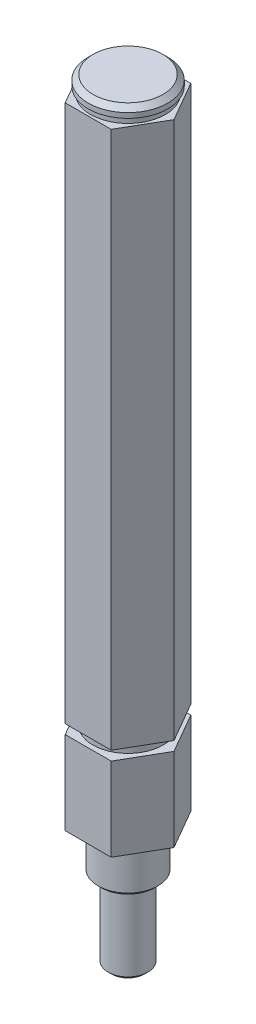
ISO-10303-21;
HEADER;
FILE_DESCRIPTION(('STEP AP214'),'2;1');
FILE_NAME('part.step','',(''),(''),'','','');
FILE_SCHEMA(('AUTOMOTIVE_DESIGN { 1 0 10303 214 1 1 1 1 }'));
ENDSEC;
DATA;
#1=APPLICATION_CONTEXT('core data for automotive mechanical design processes');
#2=APPLICATION_PROTOCOL_DEFINITION('international standard','automotive_design',2000,#1);
#3=PRODUCT_CONTEXT('',#1,'mechanical');
#4=PRODUCT('Part','Part','',(#3));
#5=PRODUCT_RELATED_PRODUCT_CATEGORY('part','',(#4));
#6=PRODUCT_DEFINITION_FORMATION('','',#4);
#7=PRODUCT_DEFINITION_CONTEXT('part definition',#1,'design');
#8=PRODUCT_DEFINITION('design','',#6,#7);
#9=PRODUCT_DEFINITION_SHAPE('','',#8);
#10=(LENGTH_UNIT() NAMED_UNIT(*) SI_UNIT(.MILLI.,.METRE.));
#11=(NAMED_UNIT(*) PLANE_ANGLE_UNIT() SI_UNIT($,.RADIAN.));
#12=(NAMED_UNIT(*) SI_UNIT($,.STERADIAN.) SOLID_ANGLE_UNIT());
#13=UNCERTAINTY_MEASURE_WITH_UNIT(LENGTH_MEASURE(1.E-05),#10,'distance_accuracy_value','');
#14=(GEOMETRIC_REPRESENTATION_CONTEXT(3) GLOBAL_UNCERTAINTY_ASSIGNED_CONTEXT((#13)) GLOBAL_UNIT_ASSIGNED_CONTEXT((#10,
#11,#12)) REPRESENTATION_CONTEXT('',''));
#15=CARTESIAN_POINT('',(0.,0.,0.));
#16=DIRECTION('',(0.,0.,1.));
#17=DIRECTION('',(1.,0.,0.));
#18=AXIS2_PLACEMENT_3D('',#15,#16,#17);
#19=CARTESIAN_POINT('',(-40.5565426092644,75.1586,-19.8153545849768));
#20=DIRECTION('',(0.,-1.,0.));
#21=DIRECTION('',(-0.813486245749684,0.,0.58158415382134));
#22=AXIS2_PLACEMENT_3D('',#19,#20,#21);
#23=PLANE('',#22);
#24=DIRECTION('',(1.,0.,0.));
#25=VECTOR('',#24,1.);
#26=CARTESIAN_POINT('',(-41.9733079254973,75.1586,-10.319011646302));
#27=LINE('',#26,#25);
#28=CARTESIAN_POINT('',(-41.9733079254973,75.1586,-10.319011646302));
#29=VERTEX_POINT('',#28);
#30=CARTESIAN_POINT('',(-34.640959506789,75.1586,-10.319011646302));
#31=VERTEX_POINT('',#30);
#32=EDGE_CURVE('E127',#29,#31,#27,.T.);
#33=ORIENTED_EDGE('',*,*,#32,.T.);
#34=DIRECTION('',(0.5,0.,-0.866025403784439));
#35=VECTOR('',#34,1.);
#36=CARTESIAN_POINT('',(-34.640959506789,75.1586,-10.319011646302));
#37=LINE('',#36,#35);
#38=CARTESIAN_POINT('',(-30.9747852974349,75.1586,-16.669011646302));
#39=VERTEX_POINT('',#38);
#40=EDGE_CURVE('E124',#31,#39,#37,.T.);
#41=ORIENTED_EDGE('',*,*,#40,.T.);
#42=DIRECTION('',(-0.5,0.,-0.866025403784439));
#43=VECTOR('',#42,1.);
#44=CARTESIAN_POINT('',(-30.9747852974349,75.1586,-16.669011646302));
#45=LINE('',#44,#43);
#46=CARTESIAN_POINT('',(-34.640959506789,75.1586,-23.019011646302));
#47=VERTEX_POINT('',#46);
#48=EDGE_CURVE('E51',#39,#47,#45,.T.);
#49=ORIENTED_EDGE('',*,*,#48,.T.);
#50=DIRECTION('',(-1.,0.,0.));
#51=VECTOR('',#50,1.);
#52=CARTESIAN_POINT('',(-34.640959506789,75.1586,-23.019011646302));
#53=LINE('',#52,#51);
#54=CARTESIAN_POINT('',(-41.9733079254973,75.1586,-23.019011646302));
#55=VERTEX_POINT('',#54);
#56=EDGE_CURVE('E135',#47,#55,#53,.T.);
#57=ORIENTED_EDGE('',*,*,#56,.T.);
#58=DIRECTION('',(-0.499999999999998,0.,0.86602540378444));
#59=VECTOR('',#58,1.);
#60=CARTESIAN_POINT('',(-41.9733079254973,75.1586,-23.019011646302));
#61=LINE('',#60,#59);
#62=CARTESIAN_POINT('',(-45.6394821348514,75.1586,-16.669011646302));
#63=VERTEX_POINT('',#62);
#64=EDGE_CURVE('E367',#55,#63,#61,.T.);
#65=ORIENTED_EDGE('',*,*,#64,.T.);
#66=DIRECTION('',(0.5,0.,0.866025403784439));
#67=VECTOR('',#66,1.);
#68=CARTESIAN_POINT('',(-45.6394821348514,75.1586,-16.669011646302));
#69=LINE('',#68,#67);
#70=EDGE_CURVE('E298',#63,#29,#69,.T.);
#71=ORIENTED_EDGE('',*,*,#70,.T.);
#72=EDGE_LOOP('',(#33,#41,#49,#57,#65,#71));
#73=FACE_BOUND('',#72,.T.);
#74=CARTESIAN_POINT('',(-38.3071337161431,75.1586,-16.669011646302));
#75=DIRECTION('',(0.,-1.,0.));
#76=DIRECTION('',(1.,0.,0.));
#77=AXIS2_PLACEMENT_3D('',#74,#75,#76);
#78=CIRCLE('',#77,5.9436);
#79=CARTESIAN_POINT('',(-32.3635337161431,75.1586,-16.669011646302));
#80=VERTEX_POINT('',#79);
#81=EDGE_CURVE('E175',#80,#80,#78,.F.);
#82=ORIENTED_EDGE('',*,*,#81,.F.);
#83=EDGE_LOOP('',(#82));
#84=FACE_BOUND('',#83,.T.);
#85=ADVANCED_FACE('F36',(#73,#84),#23,.F.);
#86=CARTESIAN_POINT('',(-38.3071337161431,-32.512,-16.669011646302));
#87=DIRECTION('',(0.,-1.,0.));
#88=DIRECTION('',(0.,0.,-1.));
#89=AXIS2_PLACEMENT_3D('',#86,#87,#88);
#90=PLANE('',#89);
#91=CARTESIAN_POINT('',(-38.3071337161431,-32.512,-16.669011646302));
#92=DIRECTION('',(0.,-1.,0.));
#93=DIRECTION('',(0.,0.,-1.));
#94=AXIS2_PLACEMENT_3D('',#91,#92,#93);
#95=CIRCLE('',#94,4.24180000000379);
#96=CARTESIAN_POINT('',(-38.3071337161431,-32.512,-20.9108116463058));
#97=VERTEX_POINT('',#96);
#98=EDGE_CURVE('E169',#97,#97,#95,.T.);
#99=ORIENTED_EDGE('',*,*,#98,.T.);
#100=EDGE_LOOP('',(#99));
#101=FACE_BOUND('',#100,.T.);
#102=CARTESIAN_POINT('',(-38.3071337161431,-32.512,-16.669011646302));
#103=DIRECTION('',(0.,-1.,0.));
#104=DIRECTION('',(0.,0.,-1.));
#105=AXIS2_PLACEMENT_3D('',#102,#103,#104);
#106=CIRCLE('',#105,3.1623);
#107=CARTESIAN_POINT('',(-38.3071337161431,-32.512,-19.831311646302));
#108=VERTEX_POINT('',#107);
#109=EDGE_CURVE('E291',#108,#108,#106,.T.);
#110=ORIENTED_EDGE('',*,*,#109,.F.);
#111=EDGE_LOOP('',(#110));
#112=FACE_BOUND('',#111,.T.);
#113=ADVANCED_FACE('F191',(#101,#112),#90,.T.);
#114=CARTESIAN_POINT('',(-41.9733079254973,-25.4,-23.019011646302));
#115=DIRECTION('',(0.,1.,0.));
#116=DIRECTION('',(0.,0.,1.));
#117=AXIS2_PLACEMENT_3D('',#114,#115,#116);
#118=PLANE('',#117);
#119=DIRECTION('',(-1.,0.,0.));
#120=VECTOR('',#119,1.);
#121=CARTESIAN_POINT('',(-34.640959506789,-25.4,-23.019011646302));
#122=LINE('',#121,#120);
#123=CARTESIAN_POINT('',(-34.640959506789,-25.4,-23.019011646302));
#124=VERTEX_POINT('',#123);
#125=CARTESIAN_POINT('',(-41.9733079254973,-25.4,-23.019011646302));
#126=VERTEX_POINT('',#125);
#127=EDGE_CURVE('E302',#124,#126,#122,.T.);
#128=ORIENTED_EDGE('',*,*,#127,.F.);
#129=DIRECTION('',(-0.499999999999999,0.,-0.866025403784439));
#130=VECTOR('',#129,1.);
#131=CARTESIAN_POINT('',(-30.9747852974349,-25.4,-16.669011646302));
#132=LINE('',#131,#130);
#133=CARTESIAN_POINT('',(-30.9747852974349,-25.4,-16.669011646302));
#134=VERTEX_POINT('',#133);
#135=EDGE_CURVE('E318',#134,#124,#132,.T.);
#136=ORIENTED_EDGE('',*,*,#135,.F.);
#137=DIRECTION('',(0.499999999999999,0.,-0.866025403784439));
#138=VECTOR('',#137,1.);
#139=CARTESIAN_POINT('',(-34.640959506789,-25.4,-10.319011646302));
#140=LINE('',#139,#138);
#141=CARTESIAN_POINT('',(-34.640959506789,-25.4,-10.319011646302));
#142=VERTEX_POINT('',#141);
#143=EDGE_CURVE('E315',#142,#134,#140,.T.);
#144=ORIENTED_EDGE('',*,*,#143,.F.);
#145=DIRECTION('',(1.,0.,0.));
#146=VECTOR('',#145,1.);
#147=CARTESIAN_POINT('',(-41.9733079254973,-25.4,-10.319011646302));
#148=LINE('',#147,#146);
#149=CARTESIAN_POINT('',(-41.9733079254973,-25.4,-10.319011646302));
#150=VERTEX_POINT('',#149);
#151=EDGE_CURVE('E312',#150,#142,#148,.T.);
#152=ORIENTED_EDGE('',*,*,#151,.F.);
#153=DIRECTION('',(0.5,0.,0.866025403784439));
#154=VECTOR('',#153,1.);
#155=CARTESIAN_POINT('',(-45.6394821348514,-25.4,-16.669011646302));
#156=LINE('',#155,#154);
#157=CARTESIAN_POINT('',(-45.6394821348514,-25.4,-16.669011646302));
#158=VERTEX_POINT('',#157);
#159=EDGE_CURVE('E309',#158,#150,#156,.T.);
#160=ORIENTED_EDGE('',*,*,#159,.F.);
#161=DIRECTION('',(-0.499999999999999,0.,0.866025403784439));
#162=VECTOR('',#161,1.);
#163=CARTESIAN_POINT('',(-41.9733079254973,-25.4,-23.019011646302));
#164=LINE('',#163,#162);
#165=EDGE_CURVE('E305',#126,#158,#164,.T.);
#166=ORIENTED_EDGE('',*,*,#165,.F.);
#167=EDGE_LOOP('',(#128,#136,#144,#152,#160,#166));
#168=FACE_BOUND('',#167,.T.);
#169=CARTESIAN_POINT('',(-38.3071337161431,-25.4,-16.669011646302));
#170=DIRECTION('',(0.,1.,0.));
#171=DIRECTION('',(0.,0.,1.));
#172=AXIS2_PLACEMENT_3D('',#169,#170,#171);
#173=CIRCLE('',#172,4.7498);
#174=CARTESIAN_POINT('',(-38.3071337161431,-25.4,-11.919211646302));
#175=VERTEX_POINT('',#174);
#176=EDGE_CURVE('E145',#175,#175,#173,.F.);
#177=ORIENTED_EDGE('',*,*,#176,.F.);
#178=EDGE_LOOP('',(#177));
#179=FACE_BOUND('',#178,.T.);
#180=ADVANCED_FACE('F196',(#168,#179),#118,.F.);
#181=CARTESIAN_POINT('',(-34.640959506789,-10.6172,-23.019011646302));
#182=DIRECTION('',(0.,1.,0.));
#183=DIRECTION('',(0.,0.,1.));
#184=AXIS2_PLACEMENT_3D('',#181,#182,#183);
#185=PLANE('',#184);
#186=DIRECTION('',(-0.5,0.,-0.866025403784439));
#187=VECTOR('',#186,1.);
#188=CARTESIAN_POINT('',(-30.9747852974349,-10.6172,-16.669011646302));
#189=LINE('',#188,#187);
#190=CARTESIAN_POINT('',(-30.9747852974349,-10.6172,-16.669011646302));
#191=VERTEX_POINT('',#190);
#192=CARTESIAN_POINT('',(-34.640959506789,-10.6172,-23.019011646302));
#193=VERTEX_POINT('',#192);
#194=EDGE_CURVE('E349',#191,#193,#189,.T.);
#195=ORIENTED_EDGE('',*,*,#194,.F.);
#196=DIRECTION('',(0.5,0.,-0.866025403784439));
#197=VECTOR('',#196,1.);
#198=CARTESIAN_POINT('',(-34.640959506789,-10.6172,-10.319011646302));
#199=LINE('',#198,#197);
#200=CARTESIAN_POINT('',(-34.640959506789,-10.6172,-10.319011646302));
#201=VERTEX_POINT('',#200);
#202=EDGE_CURVE('E140',#201,#191,#199,.T.);
#203=ORIENTED_EDGE('',*,*,#202,.F.);
#204=DIRECTION('',(1.,0.,0.));
#205=VECTOR('',#204,1.);
#206=CARTESIAN_POINT('',(-41.9733079254973,-10.6172,-10.319011646302));
#207=LINE('',#206,#205);
#208=CARTESIAN_POINT('',(-41.9733079254973,-10.6172,-10.319011646302));
#209=VERTEX_POINT('',#208);
#210=EDGE_CURVE('E359',#209,#201,#207,.T.);
#211=ORIENTED_EDGE('',*,*,#210,.F.);
#212=DIRECTION('',(0.5,0.,0.866025403784439));
#213=VECTOR('',#212,1.);
#214=CARTESIAN_POINT('',(-45.6394821348514,-10.6172,-16.669011646302));
#215=LINE('',#214,#213);
#216=CARTESIAN_POINT('',(-45.6394821348514,-10.6172,-16.669011646302));
#217=VERTEX_POINT('',#216);
#218=EDGE_CURVE('E357',#217,#209,#215,.T.);
#219=ORIENTED_EDGE('',*,*,#218,.F.);
#220=DIRECTION('',(-0.499999999999998,0.,0.86602540378444));
#221=VECTOR('',#220,1.);
#222=CARTESIAN_POINT('',(-41.9733079254973,-10.6172,-23.019011646302));
#223=LINE('',#222,#221);
#224=CARTESIAN_POINT('',(-41.9733079254973,-10.6172,-23.019011646302));
#225=VERTEX_POINT('',#224);
#226=EDGE_CURVE('E354',#225,#217,#223,.T.);
#227=ORIENTED_EDGE('',*,*,#226,.F.);
#228=DIRECTION('',(-1.,0.,0.));
#229=VECTOR('',#228,1.);
#230=CARTESIAN_POINT('',(-34.640959506789,-10.6172,-23.019011646302));
#231=LINE('',#230,#229);
#232=EDGE_CURVE('E351',#193,#225,#231,.T.);
#233=ORIENTED_EDGE('',*,*,#232,.F.);
#234=EDGE_LOOP('',(#195,#203,#211,#219,#227,#233));
#235=FACE_BOUND('',#234,.T.);
#236=CARTESIAN_POINT('',(-38.3071337161431,-10.6172,-16.669011646302));
#237=DIRECTION('',(0.,1.,0.));
#238=DIRECTION('',(0.,0.,1.));
#239=AXIS2_PLACEMENT_3D('',#236,#237,#238);
#240=CIRCLE('',#239,5.58800000000003);
#241=CARTESIAN_POINT('',(-38.3071337161431,-10.6172,-11.081011646302));
#242=VERTEX_POINT('',#241);
#243=EDGE_CURVE('E141',#242,#242,#240,.F.);
#244=ORIENTED_EDGE('',*,*,#243,.F.);
#245=EDGE_LOOP('',(#244));
#246=FACE_BOUND('',#245,.T.);
#247=ADVANCED_FACE('F219',(#235,#246),#185,.F.);
#248=CARTESIAN_POINT('',(-30.9747852974349,-10.6172,-16.669011646302));
#249=DIRECTION('',(0.866025403784439,0.,-0.5));
#250=DIRECTION('',(-0.5,0.,-0.866025403784439));
#251=AXIS2_PLACEMENT_3D('',#248,#249,#250);
#252=PLANE('',#251);
#253=ORIENTED_EDGE('',*,*,#48,.F.);
#254=DIRECTION('',(0.,1.,0.));
#255=VECTOR('',#254,1.);
#256=CARTESIAN_POINT('',(-30.9747852974349,-10.6172,-16.669011646302));
#257=LINE('',#256,#255);
#258=EDGE_CURVE('E58',#191,#39,#257,.T.);
#259=ORIENTED_EDGE('',*,*,#258,.F.);
#260=ORIENTED_EDGE('',*,*,#194,.T.);
#261=DIRECTION('',(0.,1.,0.));
#262=VECTOR('',#261,1.);
#263=CARTESIAN_POINT('',(-34.640959506789,-10.6172,-23.019011646302));
#264=LINE('',#263,#262);
#265=EDGE_CURVE('E134',#193,#47,#264,.T.);
#266=ORIENTED_EDGE('',*,*,#265,.T.);
#267=EDGE_LOOP('',(#253,#259,#260,#266));
#268=FACE_BOUND('',#267,.T.);
#269=ADVANCED_FACE('F133',(#268),#252,.T.);
#270=CARTESIAN_POINT('',(-34.640959506789,-10.6172,-10.319011646302));
#271=DIRECTION('',(0.866025403784439,0.,0.5));
#272=DIRECTION('',(0.5,0.,-0.866025403784439));
#273=AXIS2_PLACEMENT_3D('',#270,#271,#272);
#274=PLANE('',#273);
#275=ORIENTED_EDGE('',*,*,#40,.F.);
#276=DIRECTION('',(0.,1.,0.));
#277=VECTOR('',#276,1.);
#278=CARTESIAN_POINT('',(-34.640959506789,-10.6172,-10.319011646302));
#279=LINE('',#278,#277);
#280=EDGE_CURVE('E142',#201,#31,#279,.T.);
#281=ORIENTED_EDGE('',*,*,#280,.F.);
#282=ORIENTED_EDGE('',*,*,#202,.T.);
#283=ORIENTED_EDGE('',*,*,#258,.T.);
#284=EDGE_LOOP('',(#275,#281,#282,#283));
#285=FACE_BOUND('',#284,.T.);
#286=ADVANCED_FACE('F138',(#285),#274,.T.);
#287=CARTESIAN_POINT('',(-41.9733079254973,-10.6172,-10.319011646302));
#288=DIRECTION('',(0.,0.,1.));
#289=DIRECTION('',(1.,0.,0.));
#290=AXIS2_PLACEMENT_3D('',#287,#288,#289);
#291=PLANE('',#290);
#292=ORIENTED_EDGE('',*,*,#32,.F.);
#293=DIRECTION('',(0.,1.,0.));
#294=VECTOR('',#293,1.);
#295=CARTESIAN_POINT('',(-41.9733079254973,-10.6172,-10.319011646302));
#296=LINE('',#295,#294);
#297=EDGE_CURVE('E147',#209,#29,#296,.T.);
#298=ORIENTED_EDGE('',*,*,#297,.F.);
#299=ORIENTED_EDGE('',*,*,#210,.T.);
#300=ORIENTED_EDGE('',*,*,#280,.T.);
#301=EDGE_LOOP('',(#292,#298,#299,#300));
#302=FACE_BOUND('',#301,.T.);
#303=ADVANCED_FACE('F258',(#302),#291,.T.);
#304=CARTESIAN_POINT('',(-45.6394821348514,-10.6172,-16.669011646302));
#305=DIRECTION('',(-0.866025403784439,0.,0.5));
#306=DIRECTION('',(0.5,0.,0.866025403784439));
#307=AXIS2_PLACEMENT_3D('',#304,#305,#306);
#308=PLANE('',#307);
#309=ORIENTED_EDGE('',*,*,#70,.F.);
#310=DIRECTION('',(0.,1.,0.));
#311=VECTOR('',#310,1.);
#312=CARTESIAN_POINT('',(-45.6394821348514,-10.6172,-16.669011646302));
#313=LINE('',#312,#311);
#314=EDGE_CURVE('E154',#217,#63,#313,.T.);
#315=ORIENTED_EDGE('',*,*,#314,.F.);
#316=ORIENTED_EDGE('',*,*,#218,.T.);
#317=ORIENTED_EDGE('',*,*,#297,.T.);
#318=EDGE_LOOP('',(#309,#315,#316,#317));
#319=FACE_BOUND('',#318,.T.);
#320=ADVANCED_FACE('F261',(#319),#308,.T.);
#321=CARTESIAN_POINT('',(-41.9733079254973,-10.6172,-23.019011646302));
#322=DIRECTION('',(-0.86602540378444,0.,-0.499999999999998));
#323=DIRECTION('',(-0.499999999999998,0.,0.86602540378444));
#324=AXIS2_PLACEMENT_3D('',#321,#322,#323);
#325=PLANE('',#324);
#326=ORIENTED_EDGE('',*,*,#64,.F.);
#327=DIRECTION('',(0.,1.,0.));
#328=VECTOR('',#327,1.);
#329=CARTESIAN_POINT('',(-41.9733079254973,-10.6172,-23.019011646302));
#330=LINE('',#329,#328);
#331=EDGE_CURVE('E157',#225,#55,#330,.T.);
#332=ORIENTED_EDGE('',*,*,#331,.F.);
#333=ORIENTED_EDGE('',*,*,#226,.T.);
#334=ORIENTED_EDGE('',*,*,#314,.T.);
#335=EDGE_LOOP('',(#326,#332,#333,#334));
#336=FACE_BOUND('',#335,.T.);
#337=ADVANCED_FACE('F265',(#336),#325,.T.);
#338=CARTESIAN_POINT('',(-34.640959506789,-10.6172,-23.019011646302));
#339=DIRECTION('',(0.,0.,-1.));
#340=DIRECTION('',(-1.,0.,0.));
#341=AXIS2_PLACEMENT_3D('',#338,#339,#340);
#342=PLANE('',#341);
#343=ORIENTED_EDGE('',*,*,#56,.F.);
#344=ORIENTED_EDGE('',*,*,#265,.F.);
#345=ORIENTED_EDGE('',*,*,#232,.T.);
#346=ORIENTED_EDGE('',*,*,#331,.T.);
#347=EDGE_LOOP('',(#343,#344,#345,#346));
#348=FACE_BOUND('',#347,.T.);
#349=ADVANCED_FACE('F251',(#348),#342,.T.);
#350=CARTESIAN_POINT('',(-38.3071337161431,-12.1158,-16.669011646302));
#351=DIRECTION('',(0.,1.,0.));
#352=DIRECTION('',(0.,0.,1.));
#353=AXIS2_PLACEMENT_3D('',#350,#351,#352);
#354=CYLINDRICAL_SURFACE('',#353,5.58800000000003);
#355=CARTESIAN_POINT('',(-38.3071337161431,-12.1158,-16.669011646302));
#356=DIRECTION('',(0.,-1.,0.));
#357=DIRECTION('',(0.,0.,-1.));
#358=AXIS2_PLACEMENT_3D('',#355,#356,#357);
#359=CIRCLE('',#358,5.58800000000003);
#360=CARTESIAN_POINT('',(-38.3071337161431,-12.1158,-22.257011646302));
#361=VERTEX_POINT('',#360);
#362=EDGE_CURVE('E337',#361,#361,#359,.T.);
#363=ORIENTED_EDGE('',*,*,#362,.F.);
#364=EDGE_LOOP('',(#363));
#365=FACE_BOUND('',#364,.T.);
#366=ORIENTED_EDGE('',*,*,#243,.T.);
#367=EDGE_LOOP('',(#366));
#368=FACE_BOUND('',#367,.T.);
#369=ADVANCED_FACE('F225',(#365,#368),#354,.T.);
#370=CARTESIAN_POINT('',(-41.9733079254973,-12.1158,-23.019011646302));
#371=DIRECTION('',(0.,1.,0.));
#372=DIRECTION('',(0.,0.,1.));
#373=AXIS2_PLACEMENT_3D('',#370,#371,#372);
#374=PLANE('',#373);
#375=DIRECTION('',(-1.,0.,0.));
#376=VECTOR('',#375,1.);
#377=CARTESIAN_POINT('',(-34.640959506789,-12.1158,-23.019011646302));
#378=LINE('',#377,#376);
#379=CARTESIAN_POINT('',(-34.640959506789,-12.1158,-23.019011646302));
#380=VERTEX_POINT('',#379);
#381=CARTESIAN_POINT('',(-41.9733079254973,-12.1158,-23.019011646302));
#382=VERTEX_POINT('',#381);
#383=EDGE_CURVE('E293',#380,#382,#378,.T.);
#384=ORIENTED_EDGE('',*,*,#383,.T.);
#385=DIRECTION('',(-0.499999999999999,0.,0.866025403784439));
#386=VECTOR('',#385,1.);
#387=CARTESIAN_POINT('',(-41.9733079254973,-12.1158,-23.019011646302));
#388=LINE('',#387,#386);
#389=CARTESIAN_POINT('',(-45.6394821348514,-12.1158,-16.669011646302));
#390=VERTEX_POINT('',#389);
#391=EDGE_CURVE('E296',#382,#390,#388,.T.);
#392=ORIENTED_EDGE('',*,*,#391,.T.);
#393=DIRECTION('',(0.5,0.,0.866025403784439));
#394=VECTOR('',#393,1.);
#395=CARTESIAN_POINT('',(-45.6394821348514,-12.1158,-16.669011646302));
#396=LINE('',#395,#394);
#397=CARTESIAN_POINT('',(-41.9733079254973,-12.1158,-10.319011646302));
#398=VERTEX_POINT('',#397);
#399=EDGE_CURVE('E324',#390,#398,#396,.T.);
#400=ORIENTED_EDGE('',*,*,#399,.T.);
#401=DIRECTION('',(1.,0.,0.));
#402=VECTOR('',#401,1.);
#403=CARTESIAN_POINT('',(-41.9733079254973,-12.1158,-10.319011646302));
#404=LINE('',#403,#402);
#405=CARTESIAN_POINT('',(-34.640959506789,-12.1158,-10.319011646302));
#406=VERTEX_POINT('',#405);
#407=EDGE_CURVE('E327',#398,#406,#404,.T.);
#408=ORIENTED_EDGE('',*,*,#407,.T.);
#409=DIRECTION('',(0.499999999999999,0.,-0.866025403784439));
#410=VECTOR('',#409,1.);
#411=CARTESIAN_POINT('',(-34.640959506789,-12.1158,-10.319011646302));
#412=LINE('',#411,#410);
#413=CARTESIAN_POINT('',(-30.9747852974349,-12.1158,-16.669011646302));
#414=VERTEX_POINT('',#413);
#415=EDGE_CURVE('E330',#406,#414,#412,.T.);
#416=ORIENTED_EDGE('',*,*,#415,.T.);
#417=DIRECTION('',(-0.499999999999999,0.,-0.866025403784439));
#418=VECTOR('',#417,1.);
#419=CARTESIAN_POINT('',(-30.9747852974349,-12.1158,-16.669011646302));
#420=LINE('',#419,#418);
#421=EDGE_CURVE('E306',#414,#380,#420,.T.);
#422=ORIENTED_EDGE('',*,*,#421,.T.);
#423=EDGE_LOOP('',(#384,#392,#400,#408,#416,#422));
#424=FACE_BOUND('',#423,.T.);
#425=ORIENTED_EDGE('',*,*,#362,.T.);
#426=EDGE_LOOP('',(#425));
#427=FACE_BOUND('',#426,.T.);
#428=ADVANCED_FACE('F221',(#424,#427),#374,.T.);
#429=CARTESIAN_POINT('',(-34.640959506789,-25.4,-23.019011646302));
#430=DIRECTION('',(0.,0.,-1.));
#431=DIRECTION('',(-1.,0.,0.));
#432=AXIS2_PLACEMENT_3D('',#429,#430,#431);
#433=PLANE('',#432);
#434=ORIENTED_EDGE('',*,*,#383,.F.);
#435=DIRECTION('',(0.,1.,0.));
#436=VECTOR('',#435,1.);
#437=CARTESIAN_POINT('',(-34.640959506789,-25.4,-23.019011646302));
#438=LINE('',#437,#436);
#439=EDGE_CURVE('E335',#124,#380,#438,.T.);
#440=ORIENTED_EDGE('',*,*,#439,.F.);
#441=ORIENTED_EDGE('',*,*,#127,.T.);
#442=DIRECTION('',(0.,1.,0.));
#443=VECTOR('',#442,1.);
#444=CARTESIAN_POINT('',(-41.9733079254973,-25.4,-23.019011646302));
#445=LINE('',#444,#443);
#446=EDGE_CURVE('E320',#126,#382,#445,.T.);
#447=ORIENTED_EDGE('',*,*,#446,.T.);
#448=EDGE_LOOP('',(#434,#440,#441,#447));
#449=FACE_BOUND('',#448,.T.);
#450=ADVANCED_FACE('F224',(#449),#433,.T.);
#451=CARTESIAN_POINT('',(-30.9747852974349,-25.4,-16.669011646302));
#452=DIRECTION('',(0.866025403784439,0.,-0.499999999999999));
#453=DIRECTION('',(-0.499999999999999,0.,-0.866025403784439));
#454=AXIS2_PLACEMENT_3D('',#451,#452,#453);
#455=PLANE('',#454);
#456=ORIENTED_EDGE('',*,*,#421,.F.);
#457=DIRECTION('',(0.,1.,0.));
#458=VECTOR('',#457,1.);
#459=CARTESIAN_POINT('',(-30.9747852974349,-25.4,-16.669011646302));
#460=LINE('',#459,#458);
#461=EDGE_CURVE('E338',#134,#414,#460,.T.);
#462=ORIENTED_EDGE('',*,*,#461,.F.);
#463=ORIENTED_EDGE('',*,*,#135,.T.);
#464=ORIENTED_EDGE('',*,*,#439,.T.);
#465=EDGE_LOOP('',(#456,#462,#463,#464));
#466=FACE_BOUND('',#465,.T.);
#467=ADVANCED_FACE('F227',(#466),#455,.T.);
#468=CARTESIAN_POINT('',(-34.640959506789,-25.4,-10.319011646302));
#469=DIRECTION('',(0.866025403784439,0.,0.499999999999999));
#470=DIRECTION('',(0.499999999999999,0.,-0.866025403784439));
#471=AXIS2_PLACEMENT_3D('',#468,#469,#470);
#472=PLANE('',#471);
#473=ORIENTED_EDGE('',*,*,#415,.F.);
#474=DIRECTION('',(0.,1.,0.));
#475=VECTOR('',#474,1.);
#476=CARTESIAN_POINT('',(-34.640959506789,-25.4,-10.319011646302));
#477=LINE('',#476,#475);
#478=EDGE_CURVE('E340',#142,#406,#477,.T.);
#479=ORIENTED_EDGE('',*,*,#478,.F.);
#480=ORIENTED_EDGE('',*,*,#143,.T.);
#481=ORIENTED_EDGE('',*,*,#461,.T.);
#482=EDGE_LOOP('',(#473,#479,#480,#481));
#483=FACE_BOUND('',#482,.T.);
#484=ADVANCED_FACE('F230',(#483),#472,.T.);
#485=CARTESIAN_POINT('',(-41.9733079254973,-25.4,-10.319011646302));
#486=DIRECTION('',(0.,0.,1.));
#487=DIRECTION('',(1.,0.,0.));
#488=AXIS2_PLACEMENT_3D('',#485,#486,#487);
#489=PLANE('',#488);
#490=ORIENTED_EDGE('',*,*,#407,.F.);
#491=DIRECTION('',(0.,1.,0.));
#492=VECTOR('',#491,1.);
#493=CARTESIAN_POINT('',(-41.9733079254973,-25.4,-10.319011646302));
#494=LINE('',#493,#492);
#495=EDGE_CURVE('E342',#150,#398,#494,.T.);
#496=ORIENTED_EDGE('',*,*,#495,.F.);
#497=ORIENTED_EDGE('',*,*,#151,.T.);
#498=ORIENTED_EDGE('',*,*,#478,.T.);
#499=EDGE_LOOP('',(#490,#496,#497,#498));
#500=FACE_BOUND('',#499,.T.);
#501=ADVANCED_FACE('F234',(#500),#489,.T.);
#502=CARTESIAN_POINT('',(-45.6394821348514,-25.4,-16.669011646302));
#503=DIRECTION('',(-0.866025403784439,0.,0.5));
#504=DIRECTION('',(0.5,0.,0.866025403784439));
#505=AXIS2_PLACEMENT_3D('',#502,#503,#504);
#506=PLANE('',#505);
#507=ORIENTED_EDGE('',*,*,#399,.F.);
#508=DIRECTION('',(0.,1.,0.));
#509=VECTOR('',#508,1.);
#510=CARTESIAN_POINT('',(-45.6394821348514,-25.4,-16.669011646302));
#511=LINE('',#510,#509);
#512=EDGE_CURVE('E344',#158,#390,#511,.T.);
#513=ORIENTED_EDGE('',*,*,#512,.F.);
#514=ORIENTED_EDGE('',*,*,#159,.T.);
#515=ORIENTED_EDGE('',*,*,#495,.T.);
#516=EDGE_LOOP('',(#507,#513,#514,#515));
#517=FACE_BOUND('',#516,.T.);
#518=ADVANCED_FACE('F238',(#517),#506,.T.);
#519=CARTESIAN_POINT('',(-41.9733079254973,-25.4,-23.019011646302));
#520=DIRECTION('',(-0.866025403784439,0.,-0.499999999999999));
#521=DIRECTION('',(-0.499999999999999,0.,0.866025403784439));
#522=AXIS2_PLACEMENT_3D('',#519,#520,#521);
#523=PLANE('',#522);
#524=ORIENTED_EDGE('',*,*,#391,.F.);
#525=ORIENTED_EDGE('',*,*,#446,.F.);
#526=ORIENTED_EDGE('',*,*,#165,.T.);
#527=ORIENTED_EDGE('',*,*,#512,.T.);
#528=EDGE_LOOP('',(#524,#525,#526,#527));
#529=FACE_BOUND('',#528,.T.);
#530=ADVANCED_FACE('F215',(#529),#523,.T.);
#531=CARTESIAN_POINT('',(-38.3071337161431,-32.512,-16.669011646302));
#532=DIRECTION('',(0.,1.,0.));
#533=DIRECTION('',(0.,0.,1.));
#534=AXIS2_PLACEMENT_3D('',#531,#532,#533);
#535=CYLINDRICAL_SURFACE('',#534,4.7498);
#536=CARTESIAN_POINT('',(-38.3071337161431,-32.0040000000038,-16.669011646302));
#537=DIRECTION('',(0.,-1.,0.));
#538=DIRECTION('',(0.,0.,-1.));
#539=AXIS2_PLACEMENT_3D('',#536,#537,#538);
#540=CIRCLE('',#539,4.7498);
#541=CARTESIAN_POINT('',(-38.3071337161431,-32.0040000000038,-21.418811646302));
#542=VERTEX_POINT('',#541);
#543=EDGE_CURVE('E172',#542,#542,#540,.F.);
#544=ORIENTED_EDGE('',*,*,#543,.T.);
#545=EDGE_LOOP('',(#544));
#546=FACE_BOUND('',#545,.T.);
#547=ORIENTED_EDGE('',*,*,#176,.T.);
#548=EDGE_LOOP('',(#547));
#549=FACE_BOUND('',#548,.T.);
#550=ADVANCED_FACE('F210',(#546,#549),#535,.T.);
#551=CARTESIAN_POINT('',(-38.3071337161431,-45.212,-16.669011646302));
#552=DIRECTION('',(0.,1.,0.));
#553=DIRECTION('',(0.,0.,1.));
#554=AXIS2_PLACEMENT_3D('',#551,#552,#553);
#555=CYLINDRICAL_SURFACE('',#554,3.1623);
#556=CARTESIAN_POINT('',(-38.3071337161431,-44.704000000049,-16.669011646302));
#557=DIRECTION('',(0.,-1.,0.));
#558=DIRECTION('',(0.,0.,-1.));
#559=AXIS2_PLACEMENT_3D('',#556,#557,#558);
#560=CIRCLE('',#559,3.1623);
#561=CARTESIAN_POINT('',(-38.3071337161431,-44.704000000049,-19.831311646302));
#562=VERTEX_POINT('',#561);
#563=EDGE_CURVE('E166',#562,#562,#560,.F.);
#564=ORIENTED_EDGE('',*,*,#563,.T.);
#565=EDGE_LOOP('',(#564));
#566=FACE_BOUND('',#565,.T.);
#567=ORIENTED_EDGE('',*,*,#109,.T.);
#568=EDGE_LOOP('',(#567));
#569=FACE_BOUND('',#568,.T.);
#570=ADVANCED_FACE('F207',(#566,#569),#555,.T.);
#571=CARTESIAN_POINT('',(-38.3071337161431,-45.212,-16.669011646302));
#572=DIRECTION('',(0.,-1.,0.));
#573=DIRECTION('',(0.,0.,-1.));
#574=AXIS2_PLACEMENT_3D('',#571,#572,#573);
#575=PLANE('',#574);
#576=CARTESIAN_POINT('',(-38.3071337161431,-45.212,-16.669011646302));
#577=DIRECTION('',(0.,-1.,0.));
#578=DIRECTION('',(0.,0.,-1.));
#579=AXIS2_PLACEMENT_3D('',#576,#577,#578);
#580=CIRCLE('',#579,2.65430000004901);
#581=CARTESIAN_POINT('',(-38.3071337161431,-45.212,-19.323311646351));
#582=VERTEX_POINT('',#581);
#583=EDGE_CURVE('E163',#582,#582,#580,.T.);
#584=ORIENTED_EDGE('',*,*,#583,.T.);
#585=EDGE_LOOP('',(#584));
#586=FACE_BOUND('',#585,.T.);
#587=ADVANCED_FACE('F203',(#586),#575,.T.);
#588=CARTESIAN_POINT('',(-38.3071337161431,-45.212,-16.669011646302));
#589=DIRECTION('',(0.,1.,0.));
#590=DIRECTION('',(0.,0.,1.));
#591=AXIS2_PLACEMENT_3D('',#588,#589,#590);
#592=CONICAL_SURFACE('',#591,2.65430000004901,0.785398163397455);
#593=ORIENTED_EDGE('',*,*,#563,.F.);
#594=EDGE_LOOP('',(#593));
#595=FACE_BOUND('',#594,.T.);
#596=ORIENTED_EDGE('',*,*,#583,.F.);
#597=EDGE_LOOP('',(#596));
#598=FACE_BOUND('',#597,.T.);
#599=ADVANCED_FACE('F206',(#595,#598),#592,.T.);
#600=CARTESIAN_POINT('',(-38.3071337161431,-32.512,-16.669011646302));
#601=DIRECTION('',(0.,1.,0.));
#602=DIRECTION('',(0.,0.,1.));
#603=AXIS2_PLACEMENT_3D('',#600,#601,#602);
#604=CONICAL_SURFACE('',#603,4.24180000000379,0.785398163397442);
#605=ORIENTED_EDGE('',*,*,#543,.F.);
#606=EDGE_LOOP('',(#605));
#607=FACE_BOUND('',#606,.T.);
#608=ORIENTED_EDGE('',*,*,#98,.F.);
#609=EDGE_LOOP('',(#608));
#610=FACE_BOUND('',#609,.T.);
#611=ADVANCED_FACE('F276',(#607,#610),#604,.T.);
#612=CARTESIAN_POINT('',(-38.3071337161431,76.1492,-16.669011646302));
#613=DIRECTION('',(0.,-1.,0.));
#614=DIRECTION('',(1.,0.,0.));
#615=AXIS2_PLACEMENT_3D('',#612,#613,#614);
#616=CYLINDRICAL_SURFACE('',#615,5.9436);
#617=CARTESIAN_POINT('',(-38.3071337161431,76.1492,-16.669011646302));
#618=DIRECTION('',(0.,1.,0.));
#619=DIRECTION('',(-1.,0.,0.));
#620=AXIS2_PLACEMENT_3D('',#617,#618,#619);
#621=CIRCLE('',#620,5.9436);
#622=CARTESIAN_POINT('',(-44.2507337161431,76.1492,-16.669011646302));
#623=VERTEX_POINT('',#622);
#624=EDGE_CURVE('E130',#623,#623,#621,.T.);
#625=ORIENTED_EDGE('',*,*,#624,.F.);
#626=EDGE_LOOP('',(#625));
#627=FACE_BOUND('',#626,.T.);
#628=ORIENTED_EDGE('',*,*,#81,.T.);
#629=EDGE_LOOP('',(#628));
#630=FACE_BOUND('',#629,.T.);
#631=ADVANCED_FACE('F201',(#627,#630),#616,.T.);
#632=CARTESIAN_POINT('',(-38.3071337161431,76.1492,-16.669011646302));
#633=DIRECTION('',(0.,1.,0.));
#634=DIRECTION('',(-1.,0.,0.));
#635=AXIS2_PLACEMENT_3D('',#632,#633,#634);
#636=PLANE('',#635);
#637=CARTESIAN_POINT('',(-38.3071337161431,76.1492,-16.669011646302));
#638=DIRECTION('',(0.,1.,0.));
#639=DIRECTION('',(-1.,0.,0.));
#640=AXIS2_PLACEMENT_3D('',#637,#638,#639);
#641=CIRCLE('',#640,6.35);
#642=CARTESIAN_POINT('',(-44.6571337161431,76.1492,-16.669011646302));
#643=VERTEX_POINT('',#642);
#644=EDGE_CURVE('E373',#643,#643,#641,.T.);
#645=ORIENTED_EDGE('',*,*,#644,.F.);
#646=EDGE_LOOP('',(#645));
#647=FACE_BOUND('',#646,.T.);
#648=ORIENTED_EDGE('',*,*,#624,.T.);
#649=EDGE_LOOP('',(#648));
#650=FACE_BOUND('',#649,.T.);
#651=ADVANCED_FACE('F283',(#647,#650),#636,.F.);
#652=CARTESIAN_POINT('',(-38.3071337161431,77.7367,-16.669011646302));
#653=DIRECTION('',(0.,-1.,0.));
#654=DIRECTION('',(1.,0.,0.));
#655=AXIS2_PLACEMENT_3D('',#652,#653,#654);
#656=CYLINDRICAL_SURFACE('',#655,6.35);
#657=CARTESIAN_POINT('',(-38.3071337161431,76.94295,-16.669011646302));
#658=DIRECTION('',(0.,1.,0.));
#659=DIRECTION('',(0.,0.,1.));
#660=AXIS2_PLACEMENT_3D('',#657,#658,#659);
#661=CIRCLE('',#660,6.35);
#662=CARTESIAN_POINT('',(-38.3071337161431,76.94295,-10.319011646302));
#663=VERTEX_POINT('',#662);
#664=EDGE_CURVE('E11',#663,#663,#661,.F.);
#665=ORIENTED_EDGE('',*,*,#664,.T.);
#666=EDGE_LOOP('',(#665));
#667=FACE_BOUND('',#666,.T.);
#668=ORIENTED_EDGE('',*,*,#644,.T.);
#669=EDGE_LOOP('',(#668));
#670=FACE_BOUND('',#669,.T.);
#671=ADVANCED_FACE('F187',(#667,#670),#656,.T.);
#672=CARTESIAN_POINT('',(-38.3071337161431,77.7367,-16.669011646302));
#673=DIRECTION('',(0.,1.,0.));
#674=DIRECTION('',(-1.,0.,0.));
#675=AXIS2_PLACEMENT_3D('',#672,#673,#674);
#676=PLANE('',#675);
#677=CARTESIAN_POINT('',(-38.3071337161431,77.7367,-16.669011646302));
#678=DIRECTION('',(0.,1.,0.));
#679=DIRECTION('',(-1.,0.,0.));
#680=AXIS2_PLACEMENT_3D('',#677,#678,#679);
#681=CIRCLE('',#680,5.55625000000001);
#682=CARTESIAN_POINT('',(-43.8633837161431,77.7367,-16.669011646302));
#683=VERTEX_POINT('',#682);
#684=EDGE_CURVE('E44',#683,#683,#681,.T.);
#685=ORIENTED_EDGE('',*,*,#684,.T.);
#686=EDGE_LOOP('',(#685));
#687=FACE_BOUND('',#686,.T.);
#688=ADVANCED_FACE('F180',(#687),#676,.T.);
#689=CARTESIAN_POINT('',(-38.3071337161431,77.7367,-16.669011646302));
#690=DIRECTION('',(0.,-1.,0.));
#691=DIRECTION('',(0.,0.,-1.));
#692=AXIS2_PLACEMENT_3D('',#689,#690,#691);
#693=CONICAL_SURFACE('',#692,5.55625000000001,0.785398163397453);
#694=ORIENTED_EDGE('',*,*,#664,.F.);
#695=EDGE_LOOP('',(#694));
#696=FACE_BOUND('',#695,.T.);
#697=ORIENTED_EDGE('',*,*,#684,.F.);
#698=EDGE_LOOP('',(#697));
#699=FACE_BOUND('',#698,.T.);
#700=ADVANCED_FACE('F38',(#696,#699),#693,.T.);
#701=CLOSED_SHELL('',(#85,#113,#180,#247,#269,#286,#303,#320,#337,#349,#369,#428,#450,#467,#484,
#501,#518,#530,#550,#570,#587,#599,#611,#631,#651,#671,#688,#700));
#702=MANIFOLD_SOLID_BREP('B2',#701);
#703=ADVANCED_BREP_SHAPE_REPRESENTATION('',(#18,#702),#14);
#704=SHAPE_DEFINITION_REPRESENTATION(#9,#703);
ENDSEC;
END-ISO-10303-21;
